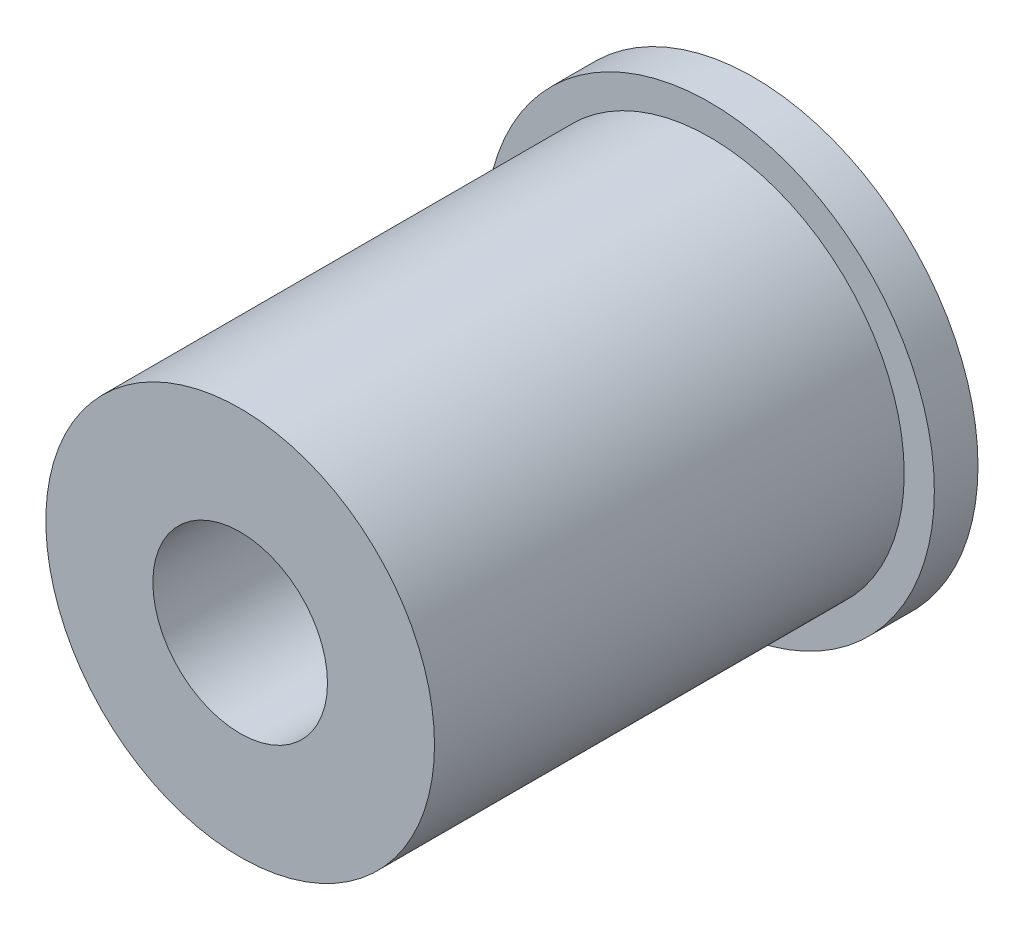
ISO-10303-21;
HEADER;
FILE_DESCRIPTION(('STEP AP214'),'2;1');
FILE_NAME('part.step','',(''),(''),'','','');
FILE_SCHEMA(('AUTOMOTIVE_DESIGN { 1 0 10303 214 1 1 1 1 }'));
ENDSEC;
DATA;
#1=APPLICATION_CONTEXT('core data for automotive mechanical design processes');
#2=APPLICATION_PROTOCOL_DEFINITION('international standard','automotive_design',2000,#1);
#3=PRODUCT_CONTEXT('',#1,'mechanical');
#4=PRODUCT('Part','Part','',(#3));
#5=PRODUCT_RELATED_PRODUCT_CATEGORY('part','',(#4));
#6=PRODUCT_DEFINITION_FORMATION('','',#4);
#7=PRODUCT_DEFINITION_CONTEXT('part definition',#1,'design');
#8=PRODUCT_DEFINITION('design','',#6,#7);
#9=PRODUCT_DEFINITION_SHAPE('','',#8);
#10=(LENGTH_UNIT() NAMED_UNIT(*) SI_UNIT(.MILLI.,.METRE.));
#11=(NAMED_UNIT(*) PLANE_ANGLE_UNIT() SI_UNIT($,.RADIAN.));
#12=(NAMED_UNIT(*) SI_UNIT($,.STERADIAN.) SOLID_ANGLE_UNIT());
#13=UNCERTAINTY_MEASURE_WITH_UNIT(LENGTH_MEASURE(1.E-05),#10,'distance_accuracy_value','');
#14=(GEOMETRIC_REPRESENTATION_CONTEXT(3) GLOBAL_UNCERTAINTY_ASSIGNED_CONTEXT((#13)) GLOBAL_UNIT_ASSIGNED_CONTEXT((#10,
#11,#12)) REPRESENTATION_CONTEXT('',''));
#15=CARTESIAN_POINT('',(0.,0.,0.));
#16=DIRECTION('',(0.,0.,1.));
#17=DIRECTION('',(1.,0.,0.));
#18=AXIS2_PLACEMENT_3D('',#15,#16,#17);
#19=CARTESIAN_POINT('',(0.,0.,0.));
#20=DIRECTION('',(0.,0.,1.));
#21=DIRECTION('',(1.,0.,0.));
#22=AXIS2_PLACEMENT_3D('',#19,#20,#21);
#23=PLANE('',#22);
#24=CARTESIAN_POINT('',(0.,0.,0.));
#25=DIRECTION('',(0.,0.,1.));
#26=DIRECTION('',(1.,0.,0.));
#27=AXIS2_PLACEMENT_3D('',#24,#25,#26);
#28=CIRCLE('',#27,2.7432);
#29=CARTESIAN_POINT('',(2.7432,0.,0.));
#30=VERTEX_POINT('',#29);
#31=EDGE_CURVE('E22',#30,#30,#28,.T.);
#32=ORIENTED_EDGE('',*,*,#31,.F.);
#33=EDGE_LOOP('',(#32));
#34=FACE_BOUND('',#33,.T.);
#35=CARTESIAN_POINT('',(0.,0.,0.));
#36=DIRECTION('',(0.,0.,1.));
#37=DIRECTION('',(1.,0.,0.));
#38=AXIS2_PLACEMENT_3D('',#35,#36,#37);
#39=CIRCLE('',#38,1.067);
#40=CARTESIAN_POINT('',(1.067,0.,0.));
#41=VERTEX_POINT('',#40);
#42=EDGE_CURVE('E38',#41,#41,#39,.T.);
#43=ORIENTED_EDGE('',*,*,#42,.T.);
#44=EDGE_LOOP('',(#43));
#45=FACE_BOUND('',#44,.T.);
#46=ADVANCED_FACE('F15',(#34,#45),#23,.F.);
#47=CARTESIAN_POINT('',(0.,0.,6.2738));
#48=DIRECTION('',(0.,0.,1.));
#49=DIRECTION('',(1.,0.,0.));
#50=AXIS2_PLACEMENT_3D('',#47,#48,#49);
#51=PLANE('',#50);
#52=CARTESIAN_POINT('',(0.,0.,6.2738));
#53=DIRECTION('',(0.,0.,1.));
#54=DIRECTION('',(1.,0.,0.));
#55=AXIS2_PLACEMENT_3D('',#52,#53,#54);
#56=CIRCLE('',#55,2.3749);
#57=CARTESIAN_POINT('',(2.3749,0.,6.2738));
#58=VERTEX_POINT('',#57);
#59=EDGE_CURVE('E26',#58,#58,#56,.T.);
#60=ORIENTED_EDGE('',*,*,#59,.T.);
#61=EDGE_LOOP('',(#60));
#62=FACE_BOUND('',#61,.T.);
#63=CARTESIAN_POINT('',(0.,0.,6.2738));
#64=DIRECTION('',(0.,0.,1.));
#65=DIRECTION('',(1.,0.,0.));
#66=AXIS2_PLACEMENT_3D('',#63,#64,#65);
#67=CIRCLE('',#66,1.067);
#68=CARTESIAN_POINT('',(1.067,0.,6.2738));
#69=VERTEX_POINT('',#68);
#70=EDGE_CURVE('E35',#69,#69,#67,.T.);
#71=ORIENTED_EDGE('',*,*,#70,.F.);
#72=EDGE_LOOP('',(#71));
#73=FACE_BOUND('',#72,.T.);
#74=ADVANCED_FACE('F57',(#62,#73),#51,.T.);
#75=CARTESIAN_POINT('',(0.,0.,0.5334));
#76=DIRECTION('',(0.,0.,1.));
#77=DIRECTION('',(1.,0.,0.));
#78=AXIS2_PLACEMENT_3D('',#75,#76,#77);
#79=PLANE('',#78);
#80=CARTESIAN_POINT('',(0.,0.,0.5334));
#81=DIRECTION('',(0.,0.,1.));
#82=DIRECTION('',(1.,0.,0.));
#83=AXIS2_PLACEMENT_3D('',#80,#81,#82);
#84=CIRCLE('',#83,2.7432);
#85=CARTESIAN_POINT('',(2.7432,0.,0.5334));
#86=VERTEX_POINT('',#85);
#87=EDGE_CURVE('E10',#86,#86,#84,.T.);
#88=ORIENTED_EDGE('',*,*,#87,.T.);
#89=EDGE_LOOP('',(#88));
#90=FACE_BOUND('',#89,.T.);
#91=CARTESIAN_POINT('',(0.,0.,0.5334));
#92=DIRECTION('',(0.,0.,1.));
#93=DIRECTION('',(1.,0.,0.));
#94=AXIS2_PLACEMENT_3D('',#91,#92,#93);
#95=CIRCLE('',#94,2.3749);
#96=CARTESIAN_POINT('',(2.3749,0.,0.5334));
#97=VERTEX_POINT('',#96);
#98=EDGE_CURVE('E30',#97,#97,#95,.T.);
#99=ORIENTED_EDGE('',*,*,#98,.F.);
#100=EDGE_LOOP('',(#99));
#101=FACE_BOUND('',#100,.T.);
#102=ADVANCED_FACE('F64',(#90,#101),#79,.T.);
#103=CARTESIAN_POINT('',(0.,0.,0.5334));
#104=DIRECTION('',(0.,0.,-1.));
#105=DIRECTION('',(-1.,0.,0.));
#106=AXIS2_PLACEMENT_3D('',#103,#104,#105);
#107=CYLINDRICAL_SURFACE('',#106,2.7432);
#108=ORIENTED_EDGE('',*,*,#87,.F.);
#109=EDGE_LOOP('',(#108));
#110=FACE_BOUND('',#109,.T.);
#111=ORIENTED_EDGE('',*,*,#31,.T.);
#112=EDGE_LOOP('',(#111));
#113=FACE_BOUND('',#112,.T.);
#114=ADVANCED_FACE('F17',(#110,#113),#107,.T.);
#115=CARTESIAN_POINT('',(0.,0.,6.2738));
#116=DIRECTION('',(0.,0.,-1.));
#117=DIRECTION('',(-1.,0.,0.));
#118=AXIS2_PLACEMENT_3D('',#115,#116,#117);
#119=CYLINDRICAL_SURFACE('',#118,2.3749);
#120=ORIENTED_EDGE('',*,*,#59,.F.);
#121=EDGE_LOOP('',(#120));
#122=FACE_BOUND('',#121,.T.);
#123=ORIENTED_EDGE('',*,*,#98,.T.);
#124=EDGE_LOOP('',(#123));
#125=FACE_BOUND('',#124,.T.);
#126=ADVANCED_FACE('F45',(#122,#125),#119,.T.);
#127=CARTESIAN_POINT('',(0.,0.,6.2738));
#128=DIRECTION('',(0.,0.,-1.));
#129=DIRECTION('',(-1.,0.,0.));
#130=AXIS2_PLACEMENT_3D('',#127,#128,#129);
#131=CYLINDRICAL_SURFACE('',#130,1.067);
#132=ORIENTED_EDGE('',*,*,#70,.T.);
#133=EDGE_LOOP('',(#132));
#134=FACE_BOUND('',#133,.T.);
#135=ORIENTED_EDGE('',*,*,#42,.F.);
#136=EDGE_LOOP('',(#135));
#137=FACE_BOUND('',#136,.T.);
#138=ADVANCED_FACE('F43',(#134,#137),#131,.F.);
#139=CLOSED_SHELL('',(#46,#74,#102,#114,#126,#138));
#140=MANIFOLD_SOLID_BREP('B1',#139);
#141=ADVANCED_BREP_SHAPE_REPRESENTATION('',(#18,#140),#14);
#142=SHAPE_DEFINITION_REPRESENTATION(#9,#141);
ENDSEC;
END-ISO-10303-21;
